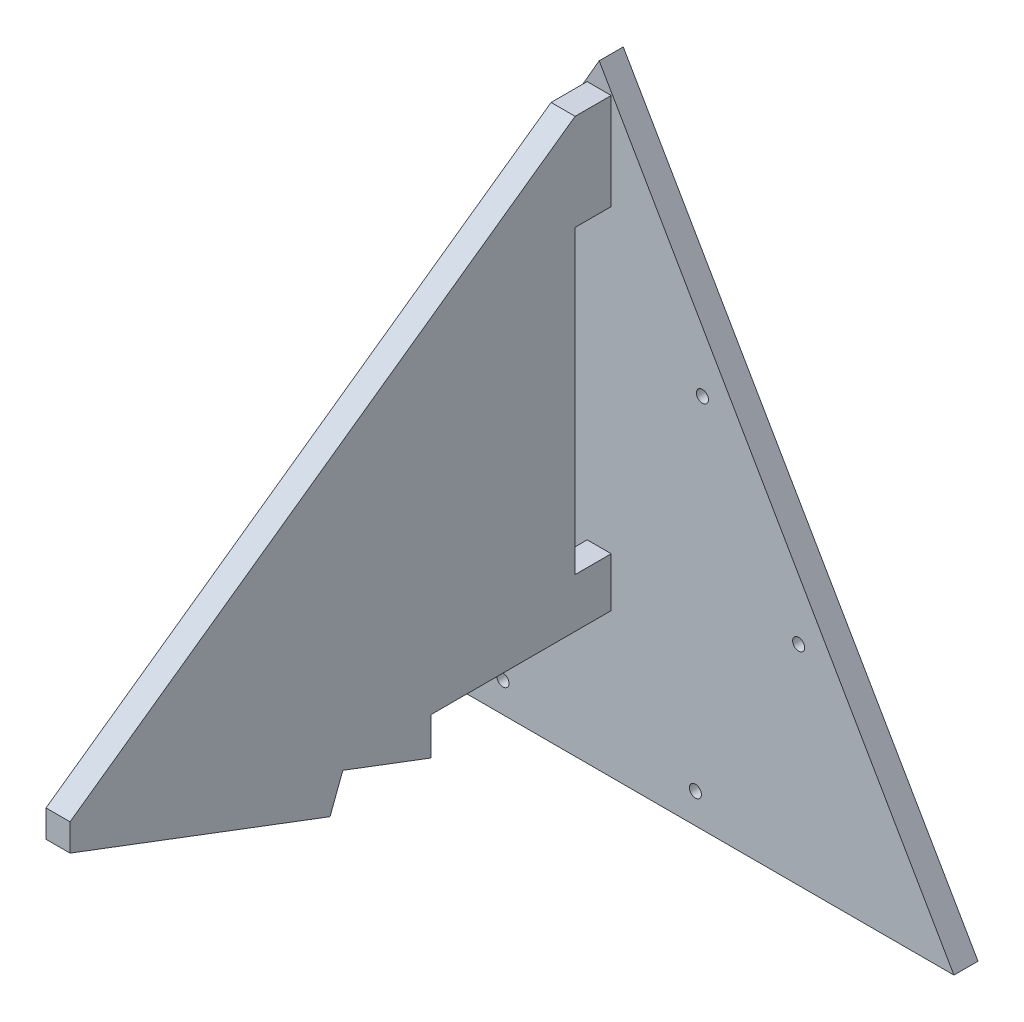
ISO-10303-21;
HEADER;
FILE_DESCRIPTION(('STEP AP214'),'2;1');
FILE_NAME('part.step','',(''),(''),'','','');
FILE_SCHEMA(('AUTOMOTIVE_DESIGN { 1 0 10303 214 1 1 1 1 }'));
ENDSEC;
DATA;
#1=APPLICATION_CONTEXT('core data for automotive mechanical design processes');
#2=APPLICATION_PROTOCOL_DEFINITION('international standard','automotive_design',2000,#1);
#3=PRODUCT_CONTEXT('',#1,'mechanical');
#4=PRODUCT('Part','Part','',(#3));
#5=PRODUCT_RELATED_PRODUCT_CATEGORY('part','',(#4));
#6=PRODUCT_DEFINITION_FORMATION('','',#4);
#7=PRODUCT_DEFINITION_CONTEXT('part definition',#1,'design');
#8=PRODUCT_DEFINITION('design','',#6,#7);
#9=PRODUCT_DEFINITION_SHAPE('','',#8);
#10=(LENGTH_UNIT() NAMED_UNIT(*) SI_UNIT(.MILLI.,.METRE.));
#11=(NAMED_UNIT(*) PLANE_ANGLE_UNIT() SI_UNIT($,.RADIAN.));
#12=(NAMED_UNIT(*) SI_UNIT($,.STERADIAN.) SOLID_ANGLE_UNIT());
#13=UNCERTAINTY_MEASURE_WITH_UNIT(LENGTH_MEASURE(1.E-05),#10,'distance_accuracy_value','');
#14=(GEOMETRIC_REPRESENTATION_CONTEXT(3) GLOBAL_UNCERTAINTY_ASSIGNED_CONTEXT((#13)) GLOBAL_UNIT_ASSIGNED_CONTEXT((#10,
#11,#12)) REPRESENTATION_CONTEXT('',''));
#15=CARTESIAN_POINT('',(0.,0.,0.));
#16=DIRECTION('',(0.,0.,1.));
#17=DIRECTION('',(1.,0.,0.));
#18=AXIS2_PLACEMENT_3D('',#15,#16,#17);
#19=CARTESIAN_POINT('',(29.5,-17.031832941094,2.));
#20=DIRECTION('',(-0.866025403784439,-0.5,0.));
#21=DIRECTION('',(0.5,-0.866025403784439,0.));
#22=AXIS2_PLACEMENT_3D('',#19,#20,#21);
#23=PLANE('',#22);
#24=DIRECTION('',(-0.5,0.866025403784439,0.));
#25=VECTOR('',#24,1.);
#26=CARTESIAN_POINT('',(29.5,-17.031832941094,0.));
#27=LINE('',#26,#25);
#28=CARTESIAN_POINT('',(29.5,-17.031832941094,0.));
#29=VERTEX_POINT('',#28);
#30=CARTESIAN_POINT('',(0.,34.0636658821879,0.));
#31=VERTEX_POINT('',#30);
#32=EDGE_CURVE('E165',#29,#31,#27,.T.);
#33=ORIENTED_EDGE('',*,*,#32,.T.);
#34=DIRECTION('',(0.,0.,-1.));
#35=VECTOR('',#34,1.);
#36=CARTESIAN_POINT('',(0.,34.0636658821879,2.));
#37=LINE('',#36,#35);
#38=CARTESIAN_POINT('',(0.,34.0636658821879,2.));
#39=VERTEX_POINT('',#38);
#40=EDGE_CURVE('E11',#39,#31,#37,.T.);
#41=ORIENTED_EDGE('',*,*,#40,.F.);
#42=DIRECTION('',(-0.5,0.866025403784439,0.));
#43=VECTOR('',#42,1.);
#44=CARTESIAN_POINT('',(29.5,-17.031832941094,2.));
#45=LINE('',#44,#43);
#46=CARTESIAN_POINT('',(29.5,-17.031832941094,2.));
#47=VERTEX_POINT('',#46);
#48=EDGE_CURVE('E251',#47,#39,#45,.T.);
#49=ORIENTED_EDGE('',*,*,#48,.F.);
#50=DIRECTION('',(0.,0.,-1.));
#51=VECTOR('',#50,1.);
#52=CARTESIAN_POINT('',(29.5,-17.031832941094,2.));
#53=LINE('',#52,#51);
#54=EDGE_CURVE('E259',#47,#29,#53,.T.);
#55=ORIENTED_EDGE('',*,*,#54,.T.);
#56=EDGE_LOOP('',(#33,#41,#49,#55));
#57=FACE_BOUND('',#56,.T.);
#58=ADVANCED_FACE('F33',(#57),#23,.F.);
#59=CARTESIAN_POINT('',(0.,34.0636658821879,2.));
#60=DIRECTION('',(0.866025403784439,-0.5,0.));
#61=DIRECTION('',(0.5,0.866025403784439,0.));
#62=AXIS2_PLACEMENT_3D('',#59,#60,#61);
#63=PLANE('',#62);
#64=DIRECTION('',(-0.5,-0.866025403784439,0.));
#65=VECTOR('',#64,1.);
#66=CARTESIAN_POINT('',(0.,34.0636658821879,0.));
#67=LINE('',#66,#65);
#68=CARTESIAN_POINT('',(-29.5,-17.031832941094,0.));
#69=VERTEX_POINT('',#68);
#70=EDGE_CURVE('E262',#31,#69,#67,.T.);
#71=ORIENTED_EDGE('',*,*,#70,.T.);
#72=DIRECTION('',(0.,0.,-1.));
#73=VECTOR('',#72,1.);
#74=CARTESIAN_POINT('',(-29.5,-17.031832941094,2.));
#75=LINE('',#74,#73);
#76=CARTESIAN_POINT('',(-29.5,-17.031832941094,2.));
#77=VERTEX_POINT('',#76);
#78=EDGE_CURVE('E40',#77,#69,#75,.T.);
#79=ORIENTED_EDGE('',*,*,#78,.F.);
#80=DIRECTION('',(-0.5,-0.866025403784439,0.));
#81=VECTOR('',#80,1.);
#82=CARTESIAN_POINT('',(0.,34.0636658821879,2.));
#83=LINE('',#82,#81);
#84=EDGE_CURVE('E254',#39,#77,#83,.T.);
#85=ORIENTED_EDGE('',*,*,#84,.F.);
#86=ORIENTED_EDGE('',*,*,#40,.T.);
#87=EDGE_LOOP('',(#71,#79,#85,#86));
#88=FACE_BOUND('',#87,.T.);
#89=ADVANCED_FACE('F281',(#88),#63,.F.);
#90=CARTESIAN_POINT('',(-29.5,-17.031832941094,2.));
#91=DIRECTION('',(0.,1.,0.));
#92=DIRECTION('',(-1.,0.,0.));
#93=AXIS2_PLACEMENT_3D('',#90,#91,#92);
#94=PLANE('',#93);
#95=DIRECTION('',(1.,0.,0.));
#96=VECTOR('',#95,1.);
#97=CARTESIAN_POINT('',(-29.5,-17.031832941094,0.));
#98=LINE('',#97,#96);
#99=EDGE_CURVE('E255',#69,#29,#98,.T.);
#100=ORIENTED_EDGE('',*,*,#99,.T.);
#101=ORIENTED_EDGE('',*,*,#54,.F.);
#102=DIRECTION('',(1.,0.,0.));
#103=VECTOR('',#102,1.);
#104=CARTESIAN_POINT('',(-29.5,-17.031832941094,2.));
#105=LINE('',#104,#103);
#106=EDGE_CURVE('E257',#77,#47,#105,.T.);
#107=ORIENTED_EDGE('',*,*,#106,.F.);
#108=ORIENTED_EDGE('',*,*,#78,.T.);
#109=EDGE_LOOP('',(#100,#101,#107,#108));
#110=FACE_BOUND('',#109,.T.);
#111=ADVANCED_FACE('F271',(#110),#94,.F.);
#112=CARTESIAN_POINT('',(0.,0.,2.));
#113=DIRECTION('',(0.,0.,1.));
#114=DIRECTION('',(1.,0.,0.));
#115=AXIS2_PLACEMENT_3D('',#112,#113,#114);
#116=PLANE('',#115);
#117=CARTESIAN_POINT('',(8.58493649053885,14.1941197008225,2.));
#118=DIRECTION('',(0.,0.,1.));
#119=DIRECTION('',(0.500000000000004,-0.866025403784436,0.));
#120=AXIS2_PLACEMENT_3D('',#117,#118,#119);
#121=CIRCLE('',#120,0.500000000000003);
#122=CARTESIAN_POINT('',(8.83493649053885,13.7611069989303,2.));
#123=VERTEX_POINT('',#122);
#124=EDGE_CURVE('E373',#123,#123,#121,.T.);
#125=ORIENTED_EDGE('',*,*,#124,.F.);
#126=EDGE_LOOP('',(#125));
#127=FACE_BOUND('',#126,.T.);
#128=CARTESIAN_POINT('',(-8.58493649053903,14.1941197008224,2.));
#129=DIRECTION('',(0.,0.,1.));
#130=DIRECTION('',(-0.499999999999992,-0.866025403784443,0.));
#131=AXIS2_PLACEMENT_3D('',#128,#129,#130);
#132=CIRCLE('',#131,0.500000000000001);
#133=CARTESIAN_POINT('',(-8.83493649053903,13.7611069989302,2.));
#134=VERTEX_POINT('',#133);
#135=EDGE_CURVE('E379',#134,#134,#132,.T.);
#136=ORIENTED_EDGE('',*,*,#135,.F.);
#137=EDGE_LOOP('',(#136));
#138=FACE_BOUND('',#137,.T.);
#139=CARTESIAN_POINT('',(-16.5849364905389,0.337713240271335,2.));
#140=DIRECTION('',(0.,0.,1.));
#141=DIRECTION('',(0.499999999999992,0.866025403784443,0.));
#142=AXIS2_PLACEMENT_3D('',#139,#140,#141);
#143=CIRCLE('',#142,0.500000000000003);
#144=CARTESIAN_POINT('',(-16.3349364905389,0.770725942163559,2.));
#145=VERTEX_POINT('',#144);
#146=EDGE_CURVE('E387',#145,#145,#143,.T.);
#147=ORIENTED_EDGE('',*,*,#146,.F.);
#148=EDGE_LOOP('',(#147));
#149=FACE_BOUND('',#148,.T.);
#150=CARTESIAN_POINT('',(16.5849364905389,0.337713240271545,2.));
#151=DIRECTION('',(0.,0.,1.));
#152=DIRECTION('',(-0.500000000000004,0.866025403784436,0.));
#153=AXIS2_PLACEMENT_3D('',#150,#151,#152);
#154=CIRCLE('',#153,0.500000000000001);
#155=CARTESIAN_POINT('',(16.3349364905389,0.770725942163764,2.));
#156=VERTEX_POINT('',#155);
#157=EDGE_CURVE('E376',#156,#156,#154,.T.);
#158=ORIENTED_EDGE('',*,*,#157,.F.);
#159=EDGE_LOOP('',(#158));
#160=FACE_BOUND('',#159,.T.);
#161=CARTESIAN_POINT('',(7.99999999999998,-14.531832941094,2.));
#162=DIRECTION('',(0.,0.,1.));
#163=DIRECTION('',(-1.,0.,0.));
#164=AXIS2_PLACEMENT_3D('',#161,#162,#163);
#165=CIRCLE('',#164,0.500000000000003);
#166=CARTESIAN_POINT('',(7.49999999999997,-14.531832941094,2.));
#167=VERTEX_POINT('',#166);
#168=EDGE_CURVE('E393',#167,#167,#165,.T.);
#169=ORIENTED_EDGE('',*,*,#168,.F.);
#170=EDGE_LOOP('',(#169));
#171=FACE_BOUND('',#170,.T.);
#172=CARTESIAN_POINT('',(-8.,-14.531832941094,2.));
#173=DIRECTION('',(0.,0.,1.));
#174=DIRECTION('',(1.,0.,0.));
#175=AXIS2_PLACEMENT_3D('',#172,#173,#174);
#176=CIRCLE('',#175,0.500000000000001);
#177=CARTESIAN_POINT('',(-7.5,-14.531832941094,2.));
#178=VERTEX_POINT('',#177);
#179=EDGE_CURVE('E399',#178,#178,#176,.T.);
#180=ORIENTED_EDGE('',*,*,#179,.F.);
#181=EDGE_LOOP('',(#180));
#182=FACE_BOUND('',#181,.T.);
#183=DIRECTION('',(0.,1.,9.49216561256099E-13));
#184=VECTOR('',#183,1.);
#185=CARTESIAN_POINT('',(1.,-0.93633411781208,2.00000000000389));
#186=LINE('',#185,#184);
#187=CARTESIAN_POINT('',(1.,-5.03183294109396,2.));
#188=VERTEX_POINT('',#187);
#189=CARTESIAN_POINT('',(1.,-0.93633411781208,2.00000000000389));
#190=VERTEX_POINT('',#189);
#191=EDGE_CURVE('E148',#188,#190,#186,.T.);
#192=ORIENTED_EDGE('',*,*,#191,.F.);
#193=DIRECTION('',(-1.,0.,0.));
#194=VECTOR('',#193,1.);
#195=CARTESIAN_POINT('',(1.,-5.03183294109396,2.));
#196=LINE('',#195,#194);
#197=CARTESIAN_POINT('',(-1.,-5.03183294109396,2.));
#198=VERTEX_POINT('',#197);
#199=EDGE_CURVE('E159',#188,#198,#196,.T.);
#200=ORIENTED_EDGE('',*,*,#199,.T.);
#201=DIRECTION('',(0.,1.,9.49216561256099E-13));
#202=VECTOR('',#201,1.);
#203=CARTESIAN_POINT('',(-1.,-0.93633411781208,2.00000000000389));
#204=LINE('',#203,#202);
#205=CARTESIAN_POINT('',(-1.,-0.93633411781208,2.));
#206=VERTEX_POINT('',#205);
#207=EDGE_CURVE('E197',#198,#206,#204,.T.);
#208=ORIENTED_EDGE('',*,*,#207,.T.);
#209=DIRECTION('',(-1.,0.,0.));
#210=VECTOR('',#209,1.);
#211=CARTESIAN_POINT('',(1.,-0.93633411781208,2.00000000000389));
#212=LINE('',#211,#210);
#213=EDGE_CURVE('E166',#190,#206,#212,.T.);
#214=ORIENTED_EDGE('',*,*,#213,.F.);
#215=EDGE_LOOP('',(#192,#200,#208,#214));
#216=FACE_BOUND('',#215,.T.);
#217=DIRECTION('',(0.,1.,0.));
#218=VECTOR('',#217,1.);
#219=CARTESIAN_POINT('',(1.,32.0636658821879,2.));
#220=LINE('',#219,#218);
#221=CARTESIAN_POINT('',(1.,24.0636658821879,2.));
#222=VERTEX_POINT('',#221);
#223=CARTESIAN_POINT('',(1.,32.0636658821879,2.));
#224=VERTEX_POINT('',#223);
#225=EDGE_CURVE('E180',#222,#224,#220,.T.);
#226=ORIENTED_EDGE('',*,*,#225,.F.);
#227=DIRECTION('',(-1.,0.,0.));
#228=VECTOR('',#227,1.);
#229=CARTESIAN_POINT('',(1.,24.0636658821879,2.));
#230=LINE('',#229,#228);
#231=CARTESIAN_POINT('',(-1.,24.0636658821879,2.));
#232=VERTEX_POINT('',#231);
#233=EDGE_CURVE('E241',#222,#232,#230,.T.);
#234=ORIENTED_EDGE('',*,*,#233,.T.);
#235=DIRECTION('',(0.,1.,0.));
#236=VECTOR('',#235,1.);
#237=CARTESIAN_POINT('',(-1.,32.0636658821879,2.));
#238=LINE('',#237,#236);
#239=CARTESIAN_POINT('',(-1.,32.0636658821879,2.));
#240=VERTEX_POINT('',#239);
#241=EDGE_CURVE('E205',#232,#240,#238,.T.);
#242=ORIENTED_EDGE('',*,*,#241,.T.);
#243=DIRECTION('',(-1.,0.,0.));
#244=VECTOR('',#243,1.);
#245=CARTESIAN_POINT('',(1.,32.0636658821879,2.));
#246=LINE('',#245,#244);
#247=EDGE_CURVE('E239',#224,#240,#246,.T.);
#248=ORIENTED_EDGE('',*,*,#247,.F.);
#249=EDGE_LOOP('',(#226,#234,#242,#248));
#250=FACE_BOUND('',#249,.T.);
#251=ORIENTED_EDGE('',*,*,#48,.T.);
#252=ORIENTED_EDGE('',*,*,#84,.T.);
#253=ORIENTED_EDGE('',*,*,#106,.T.);
#254=EDGE_LOOP('',(#251,#252,#253));
#255=FACE_BOUND('',#254,.T.);
#256=ADVANCED_FACE('F169',(#127,#138,#149,#160,#171,#182,#216,#250,#255),#116,.T.);
#257=CARTESIAN_POINT('',(0.,0.,0.));
#258=DIRECTION('',(0.,0.,1.));
#259=DIRECTION('',(1.,0.,0.));
#260=AXIS2_PLACEMENT_3D('',#257,#258,#259);
#261=PLANE('',#260);
#262=CARTESIAN_POINT('',(8.58493649053885,14.1941197008225,0.));
#263=DIRECTION('',(0.,0.,1.));
#264=DIRECTION('',(0.500000000000004,-0.866025403784436,0.));
#265=AXIS2_PLACEMENT_3D('',#262,#263,#264);
#266=CIRCLE('',#265,0.500000000000003);
#267=CARTESIAN_POINT('',(8.83493649053885,13.7611069989303,0.));
#268=VERTEX_POINT('',#267);
#269=EDGE_CURVE('E370',#268,#268,#266,.T.);
#270=ORIENTED_EDGE('',*,*,#269,.T.);
#271=EDGE_LOOP('',(#270));
#272=FACE_BOUND('',#271,.T.);
#273=CARTESIAN_POINT('',(-8.58493649053903,14.1941197008224,0.));
#274=DIRECTION('',(0.,0.,1.));
#275=DIRECTION('',(-0.499999999999992,-0.866025403784443,0.));
#276=AXIS2_PLACEMENT_3D('',#273,#274,#275);
#277=CIRCLE('',#276,0.500000000000001);
#278=CARTESIAN_POINT('',(-8.83493649053903,13.7611069989302,0.));
#279=VERTEX_POINT('',#278);
#280=EDGE_CURVE('E374',#279,#279,#277,.T.);
#281=ORIENTED_EDGE('',*,*,#280,.T.);
#282=EDGE_LOOP('',(#281));
#283=FACE_BOUND('',#282,.T.);
#284=CARTESIAN_POINT('',(-16.5849364905389,0.337713240271335,0.));
#285=DIRECTION('',(0.,0.,1.));
#286=DIRECTION('',(0.499999999999992,0.866025403784443,0.));
#287=AXIS2_PLACEMENT_3D('',#284,#285,#286);
#288=CIRCLE('',#287,0.500000000000003);
#289=CARTESIAN_POINT('',(-16.3349364905389,0.770725942163559,0.));
#290=VERTEX_POINT('',#289);
#291=EDGE_CURVE('E384',#290,#290,#288,.T.);
#292=ORIENTED_EDGE('',*,*,#291,.T.);
#293=EDGE_LOOP('',(#292));
#294=FACE_BOUND('',#293,.T.);
#295=CARTESIAN_POINT('',(16.5849364905389,0.337713240271545,0.));
#296=DIRECTION('',(0.,0.,1.));
#297=DIRECTION('',(-0.500000000000004,0.866025403784436,0.));
#298=AXIS2_PLACEMENT_3D('',#295,#296,#297);
#299=CIRCLE('',#298,0.500000000000001);
#300=CARTESIAN_POINT('',(16.3349364905389,0.770725942163764,0.));
#301=VERTEX_POINT('',#300);
#302=EDGE_CURVE('E390',#301,#301,#299,.T.);
#303=ORIENTED_EDGE('',*,*,#302,.T.);
#304=EDGE_LOOP('',(#303));
#305=FACE_BOUND('',#304,.T.);
#306=CARTESIAN_POINT('',(7.99999999999998,-14.531832941094,0.));
#307=DIRECTION('',(0.,0.,1.));
#308=DIRECTION('',(-1.,0.,0.));
#309=AXIS2_PLACEMENT_3D('',#306,#307,#308);
#310=CIRCLE('',#309,0.500000000000003);
#311=CARTESIAN_POINT('',(7.49999999999997,-14.531832941094,0.));
#312=VERTEX_POINT('',#311);
#313=EDGE_CURVE('E396',#312,#312,#310,.T.);
#314=ORIENTED_EDGE('',*,*,#313,.T.);
#315=EDGE_LOOP('',(#314));
#316=FACE_BOUND('',#315,.T.);
#317=CARTESIAN_POINT('',(-8.,-14.531832941094,0.));
#318=DIRECTION('',(0.,0.,1.));
#319=DIRECTION('',(1.,0.,0.));
#320=AXIS2_PLACEMENT_3D('',#317,#318,#319);
#321=CIRCLE('',#320,0.500000000000001);
#322=CARTESIAN_POINT('',(-7.5,-14.531832941094,0.));
#323=VERTEX_POINT('',#322);
#324=EDGE_CURVE('E198',#323,#323,#321,.T.);
#325=ORIENTED_EDGE('',*,*,#324,.T.);
#326=EDGE_LOOP('',(#325));
#327=FACE_BOUND('',#326,.T.);
#328=ORIENTED_EDGE('',*,*,#32,.F.);
#329=ORIENTED_EDGE('',*,*,#99,.F.);
#330=ORIENTED_EDGE('',*,*,#70,.F.);
#331=EDGE_LOOP('',(#328,#329,#330));
#332=FACE_BOUND('',#331,.T.);
#333=ADVANCED_FACE('F276',(#272,#283,#294,#305,#316,#327,#332),#261,.F.);
#334=CARTESIAN_POINT('',(1.,-5.03183294109396,2.));
#335=DIRECTION('',(0.,1.,0.));
#336=DIRECTION('',(0.,0.,1.));
#337=AXIS2_PLACEMENT_3D('',#334,#335,#336);
#338=PLANE('',#337);
#339=DIRECTION('',(0.,0.,-1.));
#340=VECTOR('',#339,1.);
#341=CARTESIAN_POINT('',(-1.,-5.03183294109396,2.));
#342=LINE('',#341,#340);
#343=CARTESIAN_POINT('',(-1.,-5.03183294109396,17.));
#344=VERTEX_POINT('',#343);
#345=EDGE_CURVE('E162',#344,#198,#342,.T.);
#346=ORIENTED_EDGE('',*,*,#345,.T.);
#347=ORIENTED_EDGE('',*,*,#199,.F.);
#348=DIRECTION('',(0.,0.,-1.));
#349=VECTOR('',#348,1.);
#350=CARTESIAN_POINT('',(1.,-5.03183294109396,2.));
#351=LINE('',#350,#349);
#352=CARTESIAN_POINT('',(1.,-5.03183294109396,17.));
#353=VERTEX_POINT('',#352);
#354=EDGE_CURVE('E144',#353,#188,#351,.T.);
#355=ORIENTED_EDGE('',*,*,#354,.F.);
#356=DIRECTION('',(-1.,0.,0.));
#357=VECTOR('',#356,1.);
#358=CARTESIAN_POINT('',(1.,-5.03183294109396,17.));
#359=LINE('',#358,#357);
#360=EDGE_CURVE('E195',#353,#344,#359,.T.);
#361=ORIENTED_EDGE('',*,*,#360,.T.);
#362=EDGE_LOOP('',(#346,#347,#355,#361));
#363=FACE_BOUND('',#362,.T.);
#364=ADVANCED_FACE('F160',(#363),#338,.F.);
#365=CARTESIAN_POINT('',(1.,-0.93633411781208,5.));
#366=DIRECTION('',(0.,-1.,0.));
#367=DIRECTION('',(0.,0.,-1.));
#368=AXIS2_PLACEMENT_3D('',#365,#366,#367);
#369=PLANE('',#368);
#370=DIRECTION('',(0.,0.,1.));
#371=VECTOR('',#370,1.);
#372=CARTESIAN_POINT('',(-1.,-0.93633411781208,5.));
#373=LINE('',#372,#371);
#374=CARTESIAN_POINT('',(-1.,-0.93633411781208,5.));
#375=VERTEX_POINT('',#374);
#376=EDGE_CURVE('E47',#206,#375,#373,.T.);
#377=ORIENTED_EDGE('',*,*,#376,.T.);
#378=DIRECTION('',(-1.,0.,0.));
#379=VECTOR('',#378,1.);
#380=CARTESIAN_POINT('',(1.,-0.93633411781208,5.));
#381=LINE('',#380,#379);
#382=CARTESIAN_POINT('',(1.,-0.93633411781208,5.));
#383=VERTEX_POINT('',#382);
#384=EDGE_CURVE('E247',#383,#375,#381,.T.);
#385=ORIENTED_EDGE('',*,*,#384,.F.);
#386=DIRECTION('',(0.,0.,1.));
#387=VECTOR('',#386,1.);
#388=CARTESIAN_POINT('',(1.,-0.93633411781208,5.));
#389=LINE('',#388,#387);
#390=EDGE_CURVE('E171',#190,#383,#389,.T.);
#391=ORIENTED_EDGE('',*,*,#390,.F.);
#392=ORIENTED_EDGE('',*,*,#213,.T.);
#393=EDGE_LOOP('',(#377,#385,#391,#392));
#394=FACE_BOUND('',#393,.T.);
#395=ADVANCED_FACE('F297',(#394),#369,.F.);
#396=CARTESIAN_POINT('',(1.,24.0636658821879,5.));
#397=DIRECTION('',(0.,0.,1.));
#398=DIRECTION('',(1.,0.,0.));
#399=AXIS2_PLACEMENT_3D('',#396,#397,#398);
#400=PLANE('',#399);
#401=DIRECTION('',(0.,1.,0.));
#402=VECTOR('',#401,1.);
#403=CARTESIAN_POINT('',(-1.,24.0636658821879,5.));
#404=LINE('',#403,#402);
#405=CARTESIAN_POINT('',(-1.,24.0636658821879,5.));
#406=VERTEX_POINT('',#405);
#407=EDGE_CURVE('E201',#375,#406,#404,.T.);
#408=ORIENTED_EDGE('',*,*,#407,.T.);
#409=DIRECTION('',(-1.,0.,0.));
#410=VECTOR('',#409,1.);
#411=CARTESIAN_POINT('',(1.,24.0636658821879,5.));
#412=LINE('',#411,#410);
#413=CARTESIAN_POINT('',(1.,24.0636658821879,5.));
#414=VERTEX_POINT('',#413);
#415=EDGE_CURVE('E244',#414,#406,#412,.T.);
#416=ORIENTED_EDGE('',*,*,#415,.F.);
#417=DIRECTION('',(0.,1.,0.));
#418=VECTOR('',#417,1.);
#419=CARTESIAN_POINT('',(1.,24.0636658821879,5.));
#420=LINE('',#419,#418);
#421=EDGE_CURVE('E173',#383,#414,#420,.T.);
#422=ORIENTED_EDGE('',*,*,#421,.F.);
#423=ORIENTED_EDGE('',*,*,#384,.T.);
#424=EDGE_LOOP('',(#408,#416,#422,#423));
#425=FACE_BOUND('',#424,.T.);
#426=ADVANCED_FACE('F300',(#425),#400,.F.);
#427=CARTESIAN_POINT('',(1.,24.0636658821879,2.));
#428=DIRECTION('',(0.,1.,0.));
#429=DIRECTION('',(0.,0.,1.));
#430=AXIS2_PLACEMENT_3D('',#427,#428,#429);
#431=PLANE('',#430);
#432=DIRECTION('',(0.,0.,-1.));
#433=VECTOR('',#432,1.);
#434=CARTESIAN_POINT('',(-1.,24.0636658821879,2.));
#435=LINE('',#434,#433);
#436=EDGE_CURVE('E203',#406,#232,#435,.T.);
#437=ORIENTED_EDGE('',*,*,#436,.T.);
#438=ORIENTED_EDGE('',*,*,#233,.F.);
#439=DIRECTION('',(0.,0.,-1.));
#440=VECTOR('',#439,1.);
#441=CARTESIAN_POINT('',(1.,24.0636658821879,2.));
#442=LINE('',#441,#440);
#443=EDGE_CURVE('E178',#414,#222,#442,.T.);
#444=ORIENTED_EDGE('',*,*,#443,.F.);
#445=ORIENTED_EDGE('',*,*,#415,.T.);
#446=EDGE_LOOP('',(#437,#438,#444,#445));
#447=FACE_BOUND('',#446,.T.);
#448=ADVANCED_FACE('F304',(#447),#431,.F.);
#449=CARTESIAN_POINT('',(1.,32.0636658821879,2.));
#450=DIRECTION('',(0.,-1.,0.));
#451=DIRECTION('',(0.,0.,-1.));
#452=AXIS2_PLACEMENT_3D('',#449,#450,#451);
#453=PLANE('',#452);
#454=DIRECTION('',(0.,0.,1.));
#455=VECTOR('',#454,1.);
#456=CARTESIAN_POINT('',(-1.,32.0636658821879,2.));
#457=LINE('',#456,#455);
#458=CARTESIAN_POINT('',(-1.,32.0636658821879,5.));
#459=VERTEX_POINT('',#458);
#460=EDGE_CURVE('E54',#240,#459,#457,.T.);
#461=ORIENTED_EDGE('',*,*,#460,.T.);
#462=DIRECTION('',(-1.,0.,0.));
#463=VECTOR('',#462,1.);
#464=CARTESIAN_POINT('',(1.,32.0636658821879,5.));
#465=LINE('',#464,#463);
#466=CARTESIAN_POINT('',(1.,32.0636658821879,5.));
#467=VERTEX_POINT('',#466);
#468=EDGE_CURVE('E236',#467,#459,#465,.T.);
#469=ORIENTED_EDGE('',*,*,#468,.F.);
#470=DIRECTION('',(0.,0.,1.));
#471=VECTOR('',#470,1.);
#472=CARTESIAN_POINT('',(1.,32.0636658821879,2.));
#473=LINE('',#472,#471);
#474=EDGE_CURVE('E182',#224,#467,#473,.T.);
#475=ORIENTED_EDGE('',*,*,#474,.F.);
#476=ORIENTED_EDGE('',*,*,#247,.T.);
#477=EDGE_LOOP('',(#461,#469,#475,#476));
#478=FACE_BOUND('',#477,.T.);
#479=ADVANCED_FACE('F308',(#478),#453,.F.);
#480=CARTESIAN_POINT('',(1.,32.0636658821879,5.));
#481=DIRECTION('',(0.,-0.815532011604097,-0.578711964667204));
#482=DIRECTION('',(0.,0.578711964667204,-0.815532011604097));
#483=AXIS2_PLACEMENT_3D('',#480,#481,#482);
#484=PLANE('',#483);
#485=DIRECTION('',(0.,-0.578711964667204,0.815532011604097));
#486=VECTOR('',#485,1.);
#487=CARTESIAN_POINT('',(-1.,32.0636658821879,5.));
#488=LINE('',#487,#486);
#489=CARTESIAN_POINT('',(-1.,2.25992774539243,47.));
#490=VERTEX_POINT('',#489);
#491=EDGE_CURVE('E209',#459,#490,#488,.T.);
#492=ORIENTED_EDGE('',*,*,#491,.T.);
#493=DIRECTION('',(-1.,0.,0.));
#494=VECTOR('',#493,1.);
#495=CARTESIAN_POINT('',(1.,2.25992774539243,47.));
#496=LINE('',#495,#494);
#497=CARTESIAN_POINT('',(1.,2.25992774539243,47.));
#498=VERTEX_POINT('',#497);
#499=EDGE_CURVE('E233',#498,#490,#496,.T.);
#500=ORIENTED_EDGE('',*,*,#499,.F.);
#501=DIRECTION('',(0.,-0.578711964667204,0.815532011604097));
#502=VECTOR('',#501,1.);
#503=CARTESIAN_POINT('',(1.,32.0636658821879,5.));
#504=LINE('',#503,#502);
#505=EDGE_CURVE('E184',#467,#498,#504,.T.);
#506=ORIENTED_EDGE('',*,*,#505,.F.);
#507=ORIENTED_EDGE('',*,*,#468,.T.);
#508=EDGE_LOOP('',(#492,#500,#506,#507));
#509=FACE_BOUND('',#508,.T.);
#510=ADVANCED_FACE('F312',(#509),#484,.F.);
#511=CARTESIAN_POINT('',(1.,2.25992774539243,47.));
#512=DIRECTION('',(0.,0.,-1.));
#513=DIRECTION('',(-1.,0.,0.));
#514=AXIS2_PLACEMENT_3D('',#511,#512,#513);
#515=PLANE('',#514);
#516=DIRECTION('',(0.,-1.,0.));
#517=VECTOR('',#516,1.);
#518=CARTESIAN_POINT('',(-1.,2.25992774539243,47.));
#519=LINE('',#518,#517);
#520=CARTESIAN_POINT('',(-1.,0.,47.));
#521=VERTEX_POINT('',#520);
#522=EDGE_CURVE('E211',#490,#521,#519,.T.);
#523=ORIENTED_EDGE('',*,*,#522,.T.);
#524=DIRECTION('',(-1.,0.,0.));
#525=VECTOR('',#524,1.);
#526=CARTESIAN_POINT('',(1.,0.,47.));
#527=LINE('',#526,#525);
#528=CARTESIAN_POINT('',(1.,0.,47.));
#529=VERTEX_POINT('',#528);
#530=EDGE_CURVE('E230',#529,#521,#527,.T.);
#531=ORIENTED_EDGE('',*,*,#530,.F.);
#532=DIRECTION('',(0.,-1.,0.));
#533=VECTOR('',#532,1.);
#534=CARTESIAN_POINT('',(1.,2.25992774539243,47.));
#535=LINE('',#534,#533);
#536=EDGE_CURVE('E186',#498,#529,#535,.T.);
#537=ORIENTED_EDGE('',*,*,#536,.F.);
#538=ORIENTED_EDGE('',*,*,#499,.T.);
#539=EDGE_LOOP('',(#523,#531,#537,#538));
#540=FACE_BOUND('',#539,.T.);
#541=ADVANCED_FACE('F316',(#540),#515,.F.);
#542=CARTESIAN_POINT('',(1.,-8.18234619644118,25.3813298243751));
#543=DIRECTION('',(0.,0.935253192975006,-0.353979469786111));
#544=DIRECTION('',(0.,0.353979469786111,0.935253192975006));
#545=AXIS2_PLACEMENT_3D('',#542,#543,#544);
#546=PLANE('',#545);
#547=DIRECTION('',(0.,-0.353979469786111,-0.935253192975006));
#548=VECTOR('',#547,1.);
#549=CARTESIAN_POINT('',(-1.,-8.18234619644118,25.3813298243751));
#550=LINE('',#549,#548);
#551=CARTESIAN_POINT('',(-1.,-8.18234619644118,25.3813298243751));
#552=VERTEX_POINT('',#551);
#553=EDGE_CURVE('E213',#521,#552,#550,.T.);
#554=ORIENTED_EDGE('',*,*,#553,.T.);
#555=DIRECTION('',(-1.,0.,0.));
#556=VECTOR('',#555,1.);
#557=CARTESIAN_POINT('',(1.,-8.18234619644118,25.3813298243751));
#558=LINE('',#557,#556);
#559=CARTESIAN_POINT('',(1.,-8.18234619644118,25.3813298243751));
#560=VERTEX_POINT('',#559);
#561=EDGE_CURVE('E227',#560,#552,#558,.T.);
#562=ORIENTED_EDGE('',*,*,#561,.F.);
#563=DIRECTION('',(0.,-0.353979469786111,-0.935253192975006));
#564=VECTOR('',#563,1.);
#565=CARTESIAN_POINT('',(1.,-8.18234619644118,25.3813298243751));
#566=LINE('',#565,#564);
#567=EDGE_CURVE('E188',#529,#560,#566,.T.);
#568=ORIENTED_EDGE('',*,*,#567,.F.);
#569=ORIENTED_EDGE('',*,*,#530,.T.);
#570=EDGE_LOOP('',(#554,#562,#568,#569));
#571=FACE_BOUND('',#570,.T.);
#572=ADVANCED_FACE('F320',(#571),#546,.F.);
#573=CARTESIAN_POINT('',(1.,-5.37658661751616,24.3193914150168));
#574=DIRECTION('',(0.,0.353979469786111,0.935253192975006));
#575=DIRECTION('',(0.,-0.935253192975006,0.353979469786111));
#576=AXIS2_PLACEMENT_3D('',#573,#574,#575);
#577=PLANE('',#576);
#578=DIRECTION('',(0.,0.935253192975006,-0.353979469786111));
#579=VECTOR('',#578,1.);
#580=CARTESIAN_POINT('',(-1.,-5.37658661751616,24.3193914150168));
#581=LINE('',#580,#579);
#582=CARTESIAN_POINT('',(-1.,-5.37658661751616,24.3193914150168));
#583=VERTEX_POINT('',#582);
#584=EDGE_CURVE('E215',#552,#583,#581,.T.);
#585=ORIENTED_EDGE('',*,*,#584,.T.);
#586=DIRECTION('',(-1.,0.,0.));
#587=VECTOR('',#586,1.);
#588=CARTESIAN_POINT('',(1.,-5.37658661751616,24.3193914150168));
#589=LINE('',#588,#587);
#590=CARTESIAN_POINT('',(1.,-5.37658661751616,24.3193914150168));
#591=VERTEX_POINT('',#590);
#592=EDGE_CURVE('E224',#591,#583,#589,.T.);
#593=ORIENTED_EDGE('',*,*,#592,.F.);
#594=DIRECTION('',(0.,0.935253192975006,-0.353979469786111));
#595=VECTOR('',#594,1.);
#596=CARTESIAN_POINT('',(1.,-5.37658661751616,24.3193914150168));
#597=LINE('',#596,#595);
#598=EDGE_CURVE('E190',#560,#591,#597,.T.);
#599=ORIENTED_EDGE('',*,*,#598,.F.);
#600=ORIENTED_EDGE('',*,*,#561,.T.);
#601=EDGE_LOOP('',(#585,#593,#599,#600));
#602=FACE_BOUND('',#601,.T.);
#603=ADVANCED_FACE('F324',(#602),#577,.F.);
#604=CARTESIAN_POINT('',(1.,-8.14686776887268,17.));
#605=DIRECTION('',(0.,0.935253192975006,-0.353979469786111));
#606=DIRECTION('',(0.,0.353979469786111,0.935253192975006));
#607=AXIS2_PLACEMENT_3D('',#604,#605,#606);
#608=PLANE('',#607);
#609=DIRECTION('',(0.,-0.353979469786111,-0.935253192975006));
#610=VECTOR('',#609,1.);
#611=CARTESIAN_POINT('',(-1.,-8.14686776887268,17.));
#612=LINE('',#611,#610);
#613=CARTESIAN_POINT('',(-1.,-8.14686776887268,17.));
#614=VERTEX_POINT('',#613);
#615=EDGE_CURVE('E217',#583,#614,#612,.T.);
#616=ORIENTED_EDGE('',*,*,#615,.T.);
#617=DIRECTION('',(-1.,0.,0.));
#618=VECTOR('',#617,1.);
#619=CARTESIAN_POINT('',(1.,-8.14686776887268,17.));
#620=LINE('',#619,#618);
#621=CARTESIAN_POINT('',(1.,-8.14686776887268,17.));
#622=VERTEX_POINT('',#621);
#623=EDGE_CURVE('E221',#622,#614,#620,.T.);
#624=ORIENTED_EDGE('',*,*,#623,.F.);
#625=DIRECTION('',(0.,-0.353979469786111,-0.935253192975006));
#626=VECTOR('',#625,1.);
#627=CARTESIAN_POINT('',(1.,-8.14686776887268,17.));
#628=LINE('',#627,#626);
#629=EDGE_CURVE('E192',#591,#622,#628,.T.);
#630=ORIENTED_EDGE('',*,*,#629,.F.);
#631=ORIENTED_EDGE('',*,*,#592,.T.);
#632=EDGE_LOOP('',(#616,#624,#630,#631));
#633=FACE_BOUND('',#632,.T.);
#634=ADVANCED_FACE('F328',(#633),#608,.F.);
#635=CARTESIAN_POINT('',(1.,-5.03183294109396,17.));
#636=DIRECTION('',(0.,0.,1.));
#637=DIRECTION('',(1.,0.,0.));
#638=AXIS2_PLACEMENT_3D('',#635,#636,#637);
#639=PLANE('',#638);
#640=DIRECTION('',(0.,1.,0.));
#641=VECTOR('',#640,1.);
#642=CARTESIAN_POINT('',(-1.,-5.03183294109396,17.));
#643=LINE('',#642,#641);
#644=EDGE_CURVE('E155',#614,#344,#643,.T.);
#645=ORIENTED_EDGE('',*,*,#644,.T.);
#646=ORIENTED_EDGE('',*,*,#360,.F.);
#647=DIRECTION('',(0.,1.,0.));
#648=VECTOR('',#647,1.);
#649=CARTESIAN_POINT('',(1.,-5.03183294109396,17.));
#650=LINE('',#649,#648);
#651=EDGE_CURVE('E151',#622,#353,#650,.T.);
#652=ORIENTED_EDGE('',*,*,#651,.F.);
#653=ORIENTED_EDGE('',*,*,#623,.T.);
#654=EDGE_LOOP('',(#645,#646,#652,#653));
#655=FACE_BOUND('',#654,.T.);
#656=ADVANCED_FACE('F332',(#655),#639,.F.);
#657=CARTESIAN_POINT('',(1.,0.,0.));
#658=DIRECTION('',(1.,0.,0.));
#659=DIRECTION('',(0.,0.,-1.));
#660=AXIS2_PLACEMENT_3D('',#657,#658,#659);
#661=PLANE('',#660);
#662=ORIENTED_EDGE('',*,*,#354,.T.);
#663=ORIENTED_EDGE('',*,*,#191,.T.);
#664=ORIENTED_EDGE('',*,*,#390,.T.);
#665=ORIENTED_EDGE('',*,*,#421,.T.);
#666=ORIENTED_EDGE('',*,*,#443,.T.);
#667=ORIENTED_EDGE('',*,*,#225,.T.);
#668=ORIENTED_EDGE('',*,*,#474,.T.);
#669=ORIENTED_EDGE('',*,*,#505,.T.);
#670=ORIENTED_EDGE('',*,*,#536,.T.);
#671=ORIENTED_EDGE('',*,*,#567,.T.);
#672=ORIENTED_EDGE('',*,*,#598,.T.);
#673=ORIENTED_EDGE('',*,*,#629,.T.);
#674=ORIENTED_EDGE('',*,*,#651,.T.);
#675=EDGE_LOOP('',(#662,#663,#664,#665,#666,#667,#668,#669,#670,#671,#672,#673,#674));
#676=FACE_BOUND('',#675,.T.);
#677=ADVANCED_FACE('F146',(#676),#661,.T.);
#678=CARTESIAN_POINT('',(-1.,0.,0.));
#679=DIRECTION('',(1.,0.,0.));
#680=DIRECTION('',(0.,0.,-1.));
#681=AXIS2_PLACEMENT_3D('',#678,#679,#680);
#682=PLANE('',#681);
#683=ORIENTED_EDGE('',*,*,#345,.F.);
#684=ORIENTED_EDGE('',*,*,#644,.F.);
#685=ORIENTED_EDGE('',*,*,#615,.F.);
#686=ORIENTED_EDGE('',*,*,#584,.F.);
#687=ORIENTED_EDGE('',*,*,#553,.F.);
#688=ORIENTED_EDGE('',*,*,#522,.F.);
#689=ORIENTED_EDGE('',*,*,#491,.F.);
#690=ORIENTED_EDGE('',*,*,#460,.F.);
#691=ORIENTED_EDGE('',*,*,#241,.F.);
#692=ORIENTED_EDGE('',*,*,#436,.F.);
#693=ORIENTED_EDGE('',*,*,#407,.F.);
#694=ORIENTED_EDGE('',*,*,#376,.F.);
#695=ORIENTED_EDGE('',*,*,#207,.F.);
#696=EDGE_LOOP('',(#683,#684,#685,#686,#687,#688,#689,#690,#691,#692,#693,#694,#695));
#697=FACE_BOUND('',#696,.T.);
#698=ADVANCED_FACE('F337',(#697),#682,.F.);
#699=CARTESIAN_POINT('',(-8.,-14.531832941094,0.));
#700=DIRECTION('',(0.,0.,1.));
#701=DIRECTION('',(1.,0.,0.));
#702=AXIS2_PLACEMENT_3D('',#699,#700,#701);
#703=CYLINDRICAL_SURFACE('',#702,0.500000000000001);
#704=ORIENTED_EDGE('',*,*,#324,.F.);
#705=EDGE_LOOP('',(#704));
#706=FACE_BOUND('',#705,.T.);
#707=ORIENTED_EDGE('',*,*,#179,.T.);
#708=EDGE_LOOP('',(#707));
#709=FACE_BOUND('',#708,.T.);
#710=ADVANCED_FACE('F340',(#706,#709),#703,.F.);
#711=CARTESIAN_POINT('',(7.99999999999998,-14.531832941094,0.));
#712=DIRECTION('',(0.,0.,1.));
#713=DIRECTION('',(1.,0.,0.));
#714=AXIS2_PLACEMENT_3D('',#711,#712,#713);
#715=CYLINDRICAL_SURFACE('',#714,0.500000000000003);
#716=ORIENTED_EDGE('',*,*,#313,.F.);
#717=EDGE_LOOP('',(#716));
#718=FACE_BOUND('',#717,.T.);
#719=ORIENTED_EDGE('',*,*,#168,.T.);
#720=EDGE_LOOP('',(#719));
#721=FACE_BOUND('',#720,.T.);
#722=ADVANCED_FACE('F345',(#718,#721),#715,.F.);
#723=CARTESIAN_POINT('',(16.5849364905389,0.337713240271545,0.));
#724=DIRECTION('',(0.,0.,1.));
#725=DIRECTION('',(1.,0.,0.));
#726=AXIS2_PLACEMENT_3D('',#723,#724,#725);
#727=CYLINDRICAL_SURFACE('',#726,0.500000000000001);
#728=ORIENTED_EDGE('',*,*,#302,.F.);
#729=EDGE_LOOP('',(#728));
#730=FACE_BOUND('',#729,.T.);
#731=ORIENTED_EDGE('',*,*,#157,.T.);
#732=EDGE_LOOP('',(#731));
#733=FACE_BOUND('',#732,.T.);
#734=ADVANCED_FACE('F349',(#730,#733),#727,.F.);
#735=CARTESIAN_POINT('',(-16.5849364905389,0.337713240271335,0.));
#736=DIRECTION('',(0.,0.,1.));
#737=DIRECTION('',(1.,0.,0.));
#738=AXIS2_PLACEMENT_3D('',#735,#736,#737);
#739=CYLINDRICAL_SURFACE('',#738,0.500000000000003);
#740=ORIENTED_EDGE('',*,*,#291,.F.);
#741=EDGE_LOOP('',(#740));
#742=FACE_BOUND('',#741,.T.);
#743=ORIENTED_EDGE('',*,*,#146,.T.);
#744=EDGE_LOOP('',(#743));
#745=FACE_BOUND('',#744,.T.);
#746=ADVANCED_FACE('F353',(#742,#745),#739,.F.);
#747=CARTESIAN_POINT('',(-8.58493649053903,14.1941197008224,0.));
#748=DIRECTION('',(0.,0.,1.));
#749=DIRECTION('',(1.,0.,0.));
#750=AXIS2_PLACEMENT_3D('',#747,#748,#749);
#751=CYLINDRICAL_SURFACE('',#750,0.500000000000001);
#752=ORIENTED_EDGE('',*,*,#280,.F.);
#753=EDGE_LOOP('',(#752));
#754=FACE_BOUND('',#753,.T.);
#755=ORIENTED_EDGE('',*,*,#135,.T.);
#756=EDGE_LOOP('',(#755));
#757=FACE_BOUND('',#756,.T.);
#758=ADVANCED_FACE('F357',(#754,#757),#751,.F.);
#759=CARTESIAN_POINT('',(8.58493649053885,14.1941197008225,0.));
#760=DIRECTION('',(0.,0.,1.));
#761=DIRECTION('',(1.,0.,0.));
#762=AXIS2_PLACEMENT_3D('',#759,#760,#761);
#763=CYLINDRICAL_SURFACE('',#762,0.500000000000003);
#764=ORIENTED_EDGE('',*,*,#269,.F.);
#765=EDGE_LOOP('',(#764));
#766=FACE_BOUND('',#765,.T.);
#767=ORIENTED_EDGE('',*,*,#124,.T.);
#768=EDGE_LOOP('',(#767));
#769=FACE_BOUND('',#768,.T.);
#770=ADVANCED_FACE('F361',(#766,#769),#763,.F.);
#771=CLOSED_SHELL('',(#58,#89,#111,#256,#333,#364,#395,#426,#448,#479,#510,#541,#572,#603,#634,
#656,#677,#698,#710,#722,#734,#746,#758,#770));
#772=MANIFOLD_SOLID_BREP('B2',#771);
#773=ADVANCED_BREP_SHAPE_REPRESENTATION('',(#18,#772),#14);
#774=SHAPE_DEFINITION_REPRESENTATION(#9,#773);
ENDSEC;
END-ISO-10303-21;
